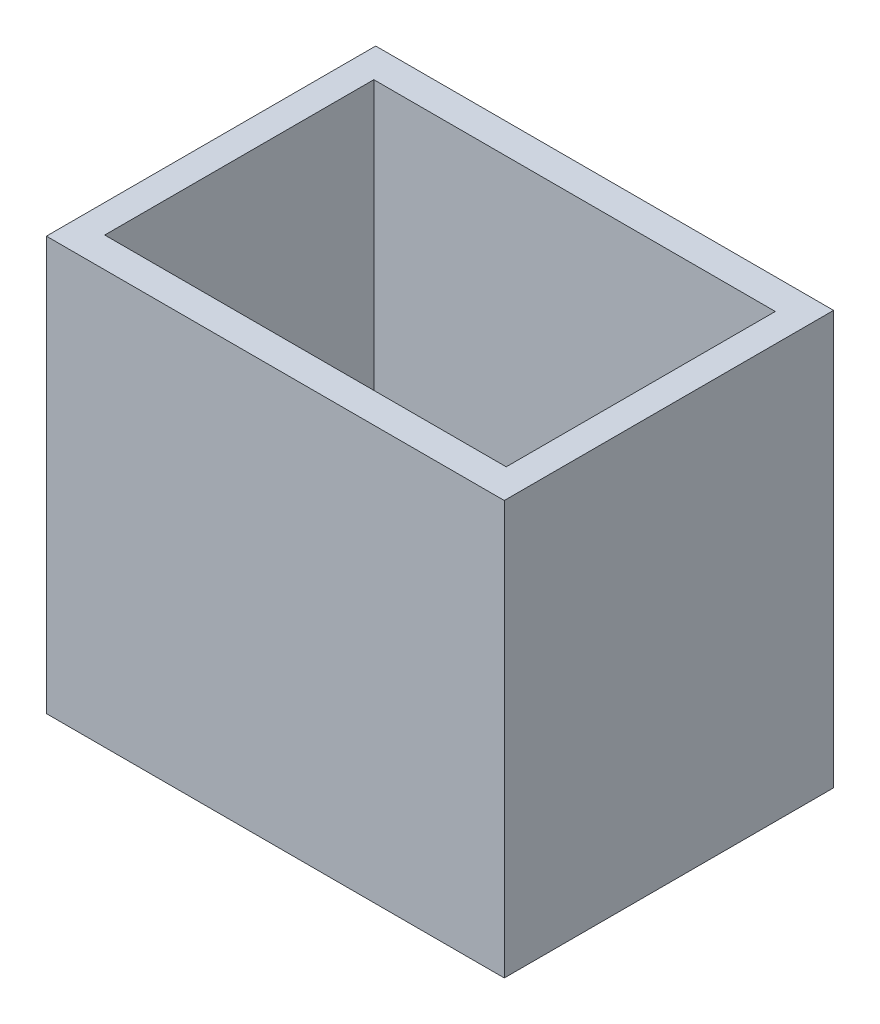
ISO-10303-21;
HEADER;
FILE_DESCRIPTION(('STEP AP214'),'2;1');
FILE_NAME('part.step','',(''),(''),'','','');
FILE_SCHEMA(('AUTOMOTIVE_DESIGN { 1 0 10303 214 1 1 1 1 }'));
ENDSEC;
DATA;
#1=APPLICATION_CONTEXT('core data for automotive mechanical design processes');
#2=APPLICATION_PROTOCOL_DEFINITION('international standard','automotive_design',2000,#1);
#3=PRODUCT_CONTEXT('',#1,'mechanical');
#4=PRODUCT('Part','Part','',(#3));
#5=PRODUCT_RELATED_PRODUCT_CATEGORY('part','',(#4));
#6=PRODUCT_DEFINITION_FORMATION('','',#4);
#7=PRODUCT_DEFINITION_CONTEXT('part definition',#1,'design');
#8=PRODUCT_DEFINITION('design','',#6,#7);
#9=PRODUCT_DEFINITION_SHAPE('','',#8);
#10=(LENGTH_UNIT() NAMED_UNIT(*) SI_UNIT(.MILLI.,.METRE.));
#11=(NAMED_UNIT(*) PLANE_ANGLE_UNIT() SI_UNIT($,.RADIAN.));
#12=(NAMED_UNIT(*) SI_UNIT($,.STERADIAN.) SOLID_ANGLE_UNIT());
#13=UNCERTAINTY_MEASURE_WITH_UNIT(LENGTH_MEASURE(1.E-05),#10,'distance_accuracy_value','');
#14=(GEOMETRIC_REPRESENTATION_CONTEXT(3) GLOBAL_UNCERTAINTY_ASSIGNED_CONTEXT((#13)) GLOBAL_UNIT_ASSIGNED_CONTEXT((#10,
#11,#12)) REPRESENTATION_CONTEXT('',''));
#15=CARTESIAN_POINT('',(0.,0.,0.));
#16=DIRECTION('',(0.,0.,1.));
#17=DIRECTION('',(1.,0.,0.));
#18=AXIS2_PLACEMENT_3D('',#15,#16,#17);
#19=CARTESIAN_POINT('',(-7.83111418426363,22.,18.7247380675204));
#20=DIRECTION('',(-1.,0.,0.));
#21=DIRECTION('',(0.,0.,1.));
#22=AXIS2_PLACEMENT_3D('',#19,#20,#21);
#23=PLANE('',#22);
#24=DIRECTION('',(0.,0.,-1.));
#25=VECTOR('',#24,1.);
#26=CARTESIAN_POINT('',(-7.83111418426363,0.,18.7247380675204));
#27=LINE('',#26,#25);
#28=CARTESIAN_POINT('',(-7.83111418426363,0.,18.7247380675204));
#29=VERTEX_POINT('',#28);
#30=CARTESIAN_POINT('',(-7.83111418426363,0.,1.20473806752038));
#31=VERTEX_POINT('',#30);
#32=EDGE_CURVE('E182',#29,#31,#27,.T.);
#33=ORIENTED_EDGE('',*,*,#32,.T.);
#34=DIRECTION('',(0.,-1.,0.));
#35=VECTOR('',#34,1.);
#36=CARTESIAN_POINT('',(-7.83111418426363,22.,1.20473806752038));
#37=LINE('',#36,#35);
#38=CARTESIAN_POINT('',(-7.83111418426363,22.,1.20473806752038));
#39=VERTEX_POINT('',#38);
#40=EDGE_CURVE('E12',#39,#31,#37,.T.);
#41=ORIENTED_EDGE('',*,*,#40,.F.);
#42=DIRECTION('',(0.,0.,-1.));
#43=VECTOR('',#42,1.);
#44=CARTESIAN_POINT('',(-7.83111418426363,22.,18.7247380675204));
#45=LINE('',#44,#43);
#46=CARTESIAN_POINT('',(-7.83111418426363,22.,18.7247380675204));
#47=VERTEX_POINT('',#46);
#48=EDGE_CURVE('E188',#47,#39,#45,.T.);
#49=ORIENTED_EDGE('',*,*,#48,.F.);
#50=DIRECTION('',(0.,-1.,0.));
#51=VECTOR('',#50,1.);
#52=CARTESIAN_POINT('',(-7.83111418426363,22.,18.7247380675204));
#53=LINE('',#52,#51);
#54=EDGE_CURVE('E198',#47,#29,#53,.T.);
#55=ORIENTED_EDGE('',*,*,#54,.T.);
#56=EDGE_LOOP('',(#33,#41,#49,#55));
#57=FACE_BOUND('',#56,.T.);
#58=ADVANCED_FACE('F63',(#57),#23,.F.);
#59=CARTESIAN_POINT('',(-7.83111418426363,22.,1.20473806752038));
#60=DIRECTION('',(0.,0.,1.));
#61=DIRECTION('',(1.,0.,0.));
#62=AXIS2_PLACEMENT_3D('',#59,#60,#61);
#63=PLANE('',#62);
#64=DIRECTION('',(-1.,0.,0.));
#65=VECTOR('',#64,1.);
#66=CARTESIAN_POINT('',(-7.83111418426363,0.,1.20473806752038));
#67=LINE('',#66,#65);
#68=CARTESIAN_POINT('',(-32.1911141842636,0.,1.20473806752038));
#69=VERTEX_POINT('',#68);
#70=EDGE_CURVE('E202',#31,#69,#67,.T.);
#71=ORIENTED_EDGE('',*,*,#70,.T.);
#72=DIRECTION('',(0.,-1.,0.));
#73=VECTOR('',#72,1.);
#74=CARTESIAN_POINT('',(-32.1911141842636,22.,1.20473806752038));
#75=LINE('',#74,#73);
#76=CARTESIAN_POINT('',(-32.1911141842636,22.,1.20473806752038));
#77=VERTEX_POINT('',#76);
#78=EDGE_CURVE('E71',#77,#69,#75,.T.);
#79=ORIENTED_EDGE('',*,*,#78,.F.);
#80=DIRECTION('',(-1.,0.,0.));
#81=VECTOR('',#80,1.);
#82=CARTESIAN_POINT('',(-7.83111418426363,22.,1.20473806752038));
#83=LINE('',#82,#81);
#84=EDGE_CURVE('E115',#39,#77,#83,.T.);
#85=ORIENTED_EDGE('',*,*,#84,.F.);
#86=ORIENTED_EDGE('',*,*,#40,.T.);
#87=EDGE_LOOP('',(#71,#79,#85,#86));
#88=FACE_BOUND('',#87,.T.);
#89=ADVANCED_FACE('F237',(#88),#63,.F.);
#90=CARTESIAN_POINT('',(-32.1911141842636,22.,1.20473806752038));
#91=DIRECTION('',(1.,0.,0.));
#92=DIRECTION('',(0.,0.,-1.));
#93=AXIS2_PLACEMENT_3D('',#90,#91,#92);
#94=PLANE('',#93);
#95=DIRECTION('',(0.,0.,1.));
#96=VECTOR('',#95,1.);
#97=CARTESIAN_POINT('',(-32.1911141842636,0.,1.20473806752038));
#98=LINE('',#97,#96);
#99=CARTESIAN_POINT('',(-32.1911141842636,0.,18.7247380675204));
#100=VERTEX_POINT('',#99);
#101=EDGE_CURVE('E205',#69,#100,#98,.T.);
#102=ORIENTED_EDGE('',*,*,#101,.T.);
#103=DIRECTION('',(0.,-1.,0.));
#104=VECTOR('',#103,1.);
#105=CARTESIAN_POINT('',(-32.1911141842636,22.,18.7247380675204));
#106=LINE('',#105,#104);
#107=CARTESIAN_POINT('',(-32.1911141842636,22.,18.7247380675204));
#108=VERTEX_POINT('',#107);
#109=EDGE_CURVE('E212',#108,#100,#106,.T.);
#110=ORIENTED_EDGE('',*,*,#109,.F.);
#111=DIRECTION('',(0.,0.,1.));
#112=VECTOR('',#111,1.);
#113=CARTESIAN_POINT('',(-32.1911141842636,22.,1.20473806752038));
#114=LINE('',#113,#112);
#115=EDGE_CURVE('E193',#77,#108,#114,.T.);
#116=ORIENTED_EDGE('',*,*,#115,.F.);
#117=ORIENTED_EDGE('',*,*,#78,.T.);
#118=EDGE_LOOP('',(#102,#110,#116,#117));
#119=FACE_BOUND('',#118,.T.);
#120=ADVANCED_FACE('F219',(#119),#94,.F.);
#121=CARTESIAN_POINT('',(-32.1911141842636,22.,18.7247380675204));
#122=DIRECTION('',(0.,0.,-1.));
#123=DIRECTION('',(-1.,0.,0.));
#124=AXIS2_PLACEMENT_3D('',#121,#122,#123);
#125=PLANE('',#124);
#126=DIRECTION('',(1.,0.,0.));
#127=VECTOR('',#126,1.);
#128=CARTESIAN_POINT('',(-32.1911141842636,0.,18.7247380675204));
#129=LINE('',#128,#127);
#130=EDGE_CURVE('E108',#100,#29,#129,.T.);
#131=ORIENTED_EDGE('',*,*,#130,.T.);
#132=ORIENTED_EDGE('',*,*,#54,.F.);
#133=DIRECTION('',(1.,0.,0.));
#134=VECTOR('',#133,1.);
#135=CARTESIAN_POINT('',(-32.1911141842636,22.,18.7247380675204));
#136=LINE('',#135,#134);
#137=EDGE_CURVE('E87',#108,#47,#136,.T.);
#138=ORIENTED_EDGE('',*,*,#137,.F.);
#139=ORIENTED_EDGE('',*,*,#109,.T.);
#140=EDGE_LOOP('',(#131,#132,#138,#139));
#141=FACE_BOUND('',#140,.T.);
#142=ADVANCED_FACE('F227',(#141),#125,.F.);
#143=CARTESIAN_POINT('',(0.,22.,0.));
#144=DIRECTION('',(0.,1.,0.));
#145=DIRECTION('',(0.,0.,1.));
#146=AXIS2_PLACEMENT_3D('',#143,#144,#145);
#147=PLANE('',#146);
#148=DIRECTION('',(0.,0.,1.));
#149=VECTOR('',#148,1.);
#150=CARTESIAN_POINT('',(-30.6901506972892,22.,0.));
#151=LINE('',#150,#149);
#152=CARTESIAN_POINT('',(-30.6901506972892,22.,2.80626107633829));
#153=VERTEX_POINT('',#152);
#154=CARTESIAN_POINT('',(-30.6901506972892,22.,17.1221095993919));
#155=VERTEX_POINT('',#154);
#156=EDGE_CURVE('E161',#153,#155,#151,.T.);
#157=ORIENTED_EDGE('',*,*,#156,.F.);
#158=DIRECTION('',(1.,0.,0.));
#159=VECTOR('',#158,1.);
#160=CARTESIAN_POINT('',(0.,22.,2.80626107633829));
#161=LINE('',#160,#159);
#162=CARTESIAN_POINT('',(-9.33111418426362,22.,2.80626107633829));
#163=VERTEX_POINT('',#162);
#164=EDGE_CURVE('E165',#153,#163,#161,.T.);
#165=ORIENTED_EDGE('',*,*,#164,.T.);
#166=DIRECTION('',(0.,0.,1.));
#167=VECTOR('',#166,1.);
#168=CARTESIAN_POINT('',(-9.33111418426362,22.,0.));
#169=LINE('',#168,#167);
#170=CARTESIAN_POINT('',(-9.33111418426362,22.,17.1221095993919));
#171=VERTEX_POINT('',#170);
#172=EDGE_CURVE('E78',#163,#171,#169,.T.);
#173=ORIENTED_EDGE('',*,*,#172,.T.);
#174=DIRECTION('',(-1.,0.,0.));
#175=VECTOR('',#174,1.);
#176=CARTESIAN_POINT('',(0.,22.,17.1221095993919));
#177=LINE('',#176,#175);
#178=EDGE_CURVE('E153',#171,#155,#177,.T.);
#179=ORIENTED_EDGE('',*,*,#178,.T.);
#180=EDGE_LOOP('',(#157,#165,#173,#179));
#181=FACE_BOUND('',#180,.T.);
#182=ORIENTED_EDGE('',*,*,#48,.T.);
#183=ORIENTED_EDGE('',*,*,#84,.T.);
#184=ORIENTED_EDGE('',*,*,#115,.T.);
#185=ORIENTED_EDGE('',*,*,#137,.T.);
#186=EDGE_LOOP('',(#182,#183,#184,#185));
#187=FACE_BOUND('',#186,.T.);
#188=ADVANCED_FACE('F229',(#181,#187),#147,.T.);
#189=CARTESIAN_POINT('',(0.,0.,0.));
#190=DIRECTION('',(0.,1.,0.));
#191=DIRECTION('',(0.,0.,1.));
#192=AXIS2_PLACEMENT_3D('',#189,#190,#191);
#193=PLANE('',#192);
#194=ORIENTED_EDGE('',*,*,#32,.F.);
#195=ORIENTED_EDGE('',*,*,#130,.F.);
#196=ORIENTED_EDGE('',*,*,#101,.F.);
#197=ORIENTED_EDGE('',*,*,#70,.F.);
#198=EDGE_LOOP('',(#194,#195,#196,#197));
#199=FACE_BOUND('',#198,.T.);
#200=ADVANCED_FACE('F223',(#199),#193,.F.);
#201=CARTESIAN_POINT('',(-30.6901506972892,0.999999999999997,0.));
#202=DIRECTION('',(-1.,0.,0.));
#203=DIRECTION('',(0.,0.,1.));
#204=AXIS2_PLACEMENT_3D('',#201,#202,#203);
#205=PLANE('',#204);
#206=ORIENTED_EDGE('',*,*,#156,.T.);
#207=DIRECTION('',(0.,1.,0.));
#208=VECTOR('',#207,1.);
#209=CARTESIAN_POINT('',(-30.6901506972892,0.999999999999997,17.1221095993919));
#210=LINE('',#209,#208);
#211=CARTESIAN_POINT('',(-30.6901506972892,0.999999999999997,17.1221095993919));
#212=VERTEX_POINT('',#211);
#213=EDGE_CURVE('E179',#212,#155,#210,.T.);
#214=ORIENTED_EDGE('',*,*,#213,.F.);
#215=DIRECTION('',(0.,0.,1.));
#216=VECTOR('',#215,1.);
#217=CARTESIAN_POINT('',(-30.6901506972892,0.999999999999997,0.));
#218=LINE('',#217,#216);
#219=CARTESIAN_POINT('',(-30.6901506972892,0.999999999999997,2.80626107633829));
#220=VERTEX_POINT('',#219);
#221=EDGE_CURVE('E155',#220,#212,#218,.T.);
#222=ORIENTED_EDGE('',*,*,#221,.F.);
#223=DIRECTION('',(0.,1.,0.));
#224=VECTOR('',#223,1.);
#225=CARTESIAN_POINT('',(-30.6901506972892,0.999999999999997,2.80626107633829));
#226=LINE('',#225,#224);
#227=EDGE_CURVE('E183',#220,#153,#226,.T.);
#228=ORIENTED_EDGE('',*,*,#227,.T.);
#229=EDGE_LOOP('',(#206,#214,#222,#228));
#230=FACE_BOUND('',#229,.T.);
#231=ADVANCED_FACE('F264',(#230),#205,.F.);
#232=CARTESIAN_POINT('',(0.,0.999999999999997,17.1221095993919));
#233=DIRECTION('',(0.,0.,-1.));
#234=DIRECTION('',(-1.,0.,0.));
#235=AXIS2_PLACEMENT_3D('',#232,#233,#234);
#236=PLANE('',#235);
#237=ORIENTED_EDGE('',*,*,#178,.F.);
#238=DIRECTION('',(0.,1.,0.));
#239=VECTOR('',#238,1.);
#240=CARTESIAN_POINT('',(-9.33111418426362,0.999999999999997,17.1221095993919));
#241=LINE('',#240,#239);
#242=CARTESIAN_POINT('',(-9.33111418426362,0.999999999999997,17.1221095993919));
#243=VERTEX_POINT('',#242);
#244=EDGE_CURVE('E139',#243,#171,#241,.T.);
#245=ORIENTED_EDGE('',*,*,#244,.F.);
#246=DIRECTION('',(-1.,0.,0.));
#247=VECTOR('',#246,1.);
#248=CARTESIAN_POINT('',(0.,0.999999999999997,17.1221095993919));
#249=LINE('',#248,#247);
#250=EDGE_CURVE('E147',#243,#212,#249,.T.);
#251=ORIENTED_EDGE('',*,*,#250,.T.);
#252=ORIENTED_EDGE('',*,*,#213,.T.);
#253=EDGE_LOOP('',(#237,#245,#251,#252));
#254=FACE_BOUND('',#253,.T.);
#255=ADVANCED_FACE('F150',(#254),#236,.T.);
#256=CARTESIAN_POINT('',(-9.33111418426362,0.999999999999997,0.));
#257=DIRECTION('',(-1.,0.,0.));
#258=DIRECTION('',(0.,0.,1.));
#259=AXIS2_PLACEMENT_3D('',#256,#257,#258);
#260=PLANE('',#259);
#261=ORIENTED_EDGE('',*,*,#172,.F.);
#262=DIRECTION('',(0.,1.,0.));
#263=VECTOR('',#262,1.);
#264=CARTESIAN_POINT('',(-9.33111418426362,0.999999999999997,2.80626107633829));
#265=LINE('',#264,#263);
#266=CARTESIAN_POINT('',(-9.33111418426362,0.999999999999997,2.80626107633829));
#267=VERTEX_POINT('',#266);
#268=EDGE_CURVE('E141',#267,#163,#265,.T.);
#269=ORIENTED_EDGE('',*,*,#268,.F.);
#270=DIRECTION('',(0.,0.,1.));
#271=VECTOR('',#270,1.);
#272=CARTESIAN_POINT('',(-9.33111418426362,0.999999999999997,0.));
#273=LINE('',#272,#271);
#274=EDGE_CURVE('E136',#267,#243,#273,.T.);
#275=ORIENTED_EDGE('',*,*,#274,.T.);
#276=ORIENTED_EDGE('',*,*,#244,.T.);
#277=EDGE_LOOP('',(#261,#269,#275,#276));
#278=FACE_BOUND('',#277,.T.);
#279=ADVANCED_FACE('F138',(#278),#260,.T.);
#280=CARTESIAN_POINT('',(0.,0.999999999999997,2.80626107633829));
#281=DIRECTION('',(0.,0.,1.));
#282=DIRECTION('',(1.,0.,0.));
#283=AXIS2_PLACEMENT_3D('',#280,#281,#282);
#284=PLANE('',#283);
#285=ORIENTED_EDGE('',*,*,#164,.F.);
#286=ORIENTED_EDGE('',*,*,#227,.F.);
#287=DIRECTION('',(1.,0.,0.));
#288=VECTOR('',#287,1.);
#289=CARTESIAN_POINT('',(0.,0.999999999999997,2.80626107633829));
#290=LINE('',#289,#288);
#291=EDGE_CURVE('E146',#220,#267,#290,.T.);
#292=ORIENTED_EDGE('',*,*,#291,.T.);
#293=ORIENTED_EDGE('',*,*,#268,.T.);
#294=EDGE_LOOP('',(#285,#286,#292,#293));
#295=FACE_BOUND('',#294,.T.);
#296=ADVANCED_FACE('F297',(#295),#284,.T.);
#297=CARTESIAN_POINT('',(0.,0.999999999999997,0.));
#298=DIRECTION('',(0.,1.,0.));
#299=DIRECTION('',(0.,0.,1.));
#300=AXIS2_PLACEMENT_3D('',#297,#298,#299);
#301=PLANE('',#300);
#302=ORIENTED_EDGE('',*,*,#250,.F.);
#303=ORIENTED_EDGE('',*,*,#274,.F.);
#304=ORIENTED_EDGE('',*,*,#291,.F.);
#305=ORIENTED_EDGE('',*,*,#221,.T.);
#306=EDGE_LOOP('',(#302,#303,#304,#305));
#307=FACE_BOUND('',#306,.T.);
#308=ADVANCED_FACE('F158',(#307),#301,.T.);
#309=CLOSED_SHELL('',(#58,#89,#120,#142,#188,#200,#231,#255,#279,#296,#308));
#310=MANIFOLD_SOLID_BREP('B2',#309);
#311=ADVANCED_BREP_SHAPE_REPRESENTATION('',(#18,#310),#14);
#312=SHAPE_DEFINITION_REPRESENTATION(#9,#311);
ENDSEC;
END-ISO-10303-21;
